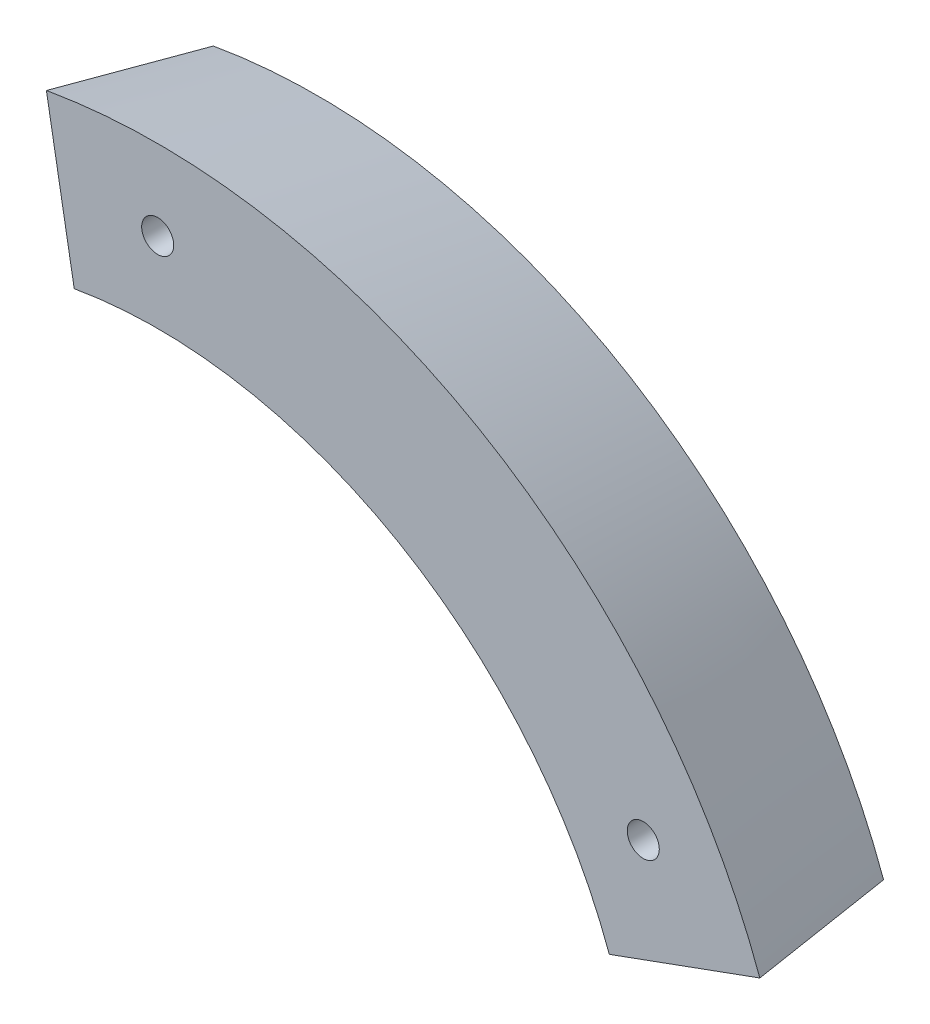
ISO-10303-21;
HEADER;
FILE_DESCRIPTION(('STEP AP214'),'2;1');
FILE_NAME('part.step','',(''),(''),'','','');
FILE_SCHEMA(('AUTOMOTIVE_DESIGN { 1 0 10303 214 1 1 1 1 }'));
ENDSEC;
DATA;
#1=APPLICATION_CONTEXT('core data for automotive mechanical design processes');
#2=APPLICATION_PROTOCOL_DEFINITION('international standard','automotive_design',2000,#1);
#3=PRODUCT_CONTEXT('',#1,'mechanical');
#4=PRODUCT('Part','Part','',(#3));
#5=PRODUCT_RELATED_PRODUCT_CATEGORY('part','',(#4));
#6=PRODUCT_DEFINITION_FORMATION('','',#4);
#7=PRODUCT_DEFINITION_CONTEXT('part definition',#1,'design');
#8=PRODUCT_DEFINITION('design','',#6,#7);
#9=PRODUCT_DEFINITION_SHAPE('','',#8);
#10=(LENGTH_UNIT() NAMED_UNIT(*) SI_UNIT(.MILLI.,.METRE.));
#11=(NAMED_UNIT(*) PLANE_ANGLE_UNIT() SI_UNIT($,.RADIAN.));
#12=(NAMED_UNIT(*) SI_UNIT($,.STERADIAN.) SOLID_ANGLE_UNIT());
#13=UNCERTAINTY_MEASURE_WITH_UNIT(LENGTH_MEASURE(1.E-05),#10,'distance_accuracy_value','');
#14=(GEOMETRIC_REPRESENTATION_CONTEXT(3) GLOBAL_UNCERTAINTY_ASSIGNED_CONTEXT((#13)) GLOBAL_UNIT_ASSIGNED_CONTEXT((#10,
#11,#12)) REPRESENTATION_CONTEXT('',''));
#15=CARTESIAN_POINT('',(0.,0.,0.));
#16=DIRECTION('',(0.,0.,1.));
#17=DIRECTION('',(1.,0.,0.));
#18=AXIS2_PLACEMENT_3D('',#15,#16,#17);
#19=CARTESIAN_POINT('',(0.,0.,0.));
#20=DIRECTION('',(0.,0.,1.));
#21=DIRECTION('',(1.,0.,0.));
#22=AXIS2_PLACEMENT_3D('',#19,#20,#21);
#23=PLANE('',#22);
#24=CARTESIAN_POINT('',(0.,52.5,0.));
#25=DIRECTION('',(0.,0.,1.));
#26=DIRECTION('',(1.,0.,0.));
#27=AXIS2_PLACEMENT_3D('',#24,#25,#26);
#28=CIRCLE('',#27,3.);
#29=CARTESIAN_POINT('',(3.,52.5,0.));
#30=VERTEX_POINT('',#29);
#31=EDGE_CURVE('E121',#30,#30,#28,.T.);
#32=ORIENTED_EDGE('',*,*,#31,.T.);
#33=EDGE_LOOP('',(#32));
#34=FACE_BOUND('',#33,.T.);
#35=CARTESIAN_POINT('',(45.4663336986831,26.2499999999999,0.));
#36=DIRECTION('',(0.,0.,1.));
#37=DIRECTION('',(1.,0.,0.));
#38=AXIS2_PLACEMENT_3D('',#35,#36,#37);
#39=CIRCLE('',#38,3.);
#40=CARTESIAN_POINT('',(48.4663336986831,26.2499999999999,0.));
#41=VERTEX_POINT('',#40);
#42=EDGE_CURVE('E127',#41,#41,#39,.T.);
#43=ORIENTED_EDGE('',*,*,#42,.T.);
#44=EDGE_LOOP('',(#43));
#45=FACE_BOUND('',#44,.T.);
#46=DIRECTION('',(-0.173648177666924,0.984807753012209,0.));
#47=VECTOR('',#46,1.);
#48=CARTESIAN_POINT('',(0.,0.,0.));
#49=LINE('',#48,#47);
#50=CARTESIAN_POINT('',(-7.81416799501157,44.3163488855494,0.));
#51=VERTEX_POINT('',#50);
#52=CARTESIAN_POINT('',(-9.78820516899551,55.5116700216144,0.));
#53=VERTEX_POINT('',#52);
#54=EDGE_CURVE('E95',#51,#53,#49,.T.);
#55=ORIENTED_EDGE('',*,*,#54,.T.);
#56=CARTESIAN_POINT('',(0.,0.,0.));
#57=DIRECTION('',(0.,0.,1.));
#58=DIRECTION('',(1.,0.,0.));
#59=AXIS2_PLACEMENT_3D('',#56,#57,#58);
#60=CIRCLE('',#59,56.3680270101674);
#61=CARTESIAN_POINT('',(52.968619029715,19.2790006770029,0.));
#62=VERTEX_POINT('',#61);
#63=EDGE_CURVE('E201',#62,#53,#60,.T.);
#64=ORIENTED_EDGE('',*,*,#63,.F.);
#65=DIRECTION('',(0.939692620785907,0.342020143325673,0.));
#66=VECTOR('',#65,1.);
#67=CARTESIAN_POINT('',(0.,0.,0.));
#68=LINE('',#67,#66);
#69=CARTESIAN_POINT('',(42.2861679353658,15.3909064496553,0.));
#70=VERTEX_POINT('',#69);
#71=EDGE_CURVE('E97',#70,#62,#68,.T.);
#72=ORIENTED_EDGE('',*,*,#71,.F.);
#73=CARTESIAN_POINT('',(0.,0.,0.));
#74=DIRECTION('',(0.,0.,1.));
#75=DIRECTION('',(1.,0.,0.));
#76=AXIS2_PLACEMENT_3D('',#73,#74,#75);
#77=CIRCLE('',#76,45.);
#78=EDGE_CURVE('E85',#70,#51,#77,.T.);
#79=ORIENTED_EDGE('',*,*,#78,.T.);
#80=EDGE_LOOP('',(#55,#64,#72,#79));
#81=FACE_BOUND('',#80,.T.);
#82=ADVANCED_FACE('F47',(#34,#45,#81),#23,.F.);
#83=CARTESIAN_POINT('',(0.,0.,15.));
#84=DIRECTION('',(0.,0.,-1.));
#85=DIRECTION('',(-1.,0.,0.));
#86=AXIS2_PLACEMENT_3D('',#83,#84,#85);
#87=CYLINDRICAL_SURFACE('',#86,45.);
#88=ORIENTED_EDGE('',*,*,#78,.F.);
#89=DIRECTION('',(0.,0.,-1.));
#90=VECTOR('',#89,1.);
#91=CARTESIAN_POINT('',(42.2861679353658,15.3909064496553,15.));
#92=LINE('',#91,#90);
#93=CARTESIAN_POINT('',(42.2861679353658,15.3909064496553,15.));
#94=VERTEX_POINT('',#93);
#95=EDGE_CURVE('E11',#94,#70,#92,.T.);
#96=ORIENTED_EDGE('',*,*,#95,.F.);
#97=CARTESIAN_POINT('',(0.,0.,15.));
#98=DIRECTION('',(0.,0.,1.));
#99=DIRECTION('',(1.,0.,0.));
#100=AXIS2_PLACEMENT_3D('',#97,#98,#99);
#101=CIRCLE('',#100,45.);
#102=CARTESIAN_POINT('',(-7.81416799501157,44.3163488855494,15.));
#103=VERTEX_POINT('',#102);
#104=EDGE_CURVE('E87',#94,#103,#101,.T.);
#105=ORIENTED_EDGE('',*,*,#104,.T.);
#106=DIRECTION('',(0.,0.,-1.));
#107=VECTOR('',#106,1.);
#108=CARTESIAN_POINT('',(-7.81416799501157,44.3163488855494,15.));
#109=LINE('',#108,#107);
#110=EDGE_CURVE('E57',#103,#51,#109,.T.);
#111=ORIENTED_EDGE('',*,*,#110,.T.);
#112=EDGE_LOOP('',(#88,#96,#105,#111));
#113=FACE_BOUND('',#112,.T.);
#114=ADVANCED_FACE('F49',(#113),#87,.F.);
#115=CARTESIAN_POINT('',(0.,0.,15.));
#116=DIRECTION('',(-0.342020143325673,0.939692620785907,0.));
#117=DIRECTION('',(-0.939692620785907,-0.342020143325673,0.));
#118=AXIS2_PLACEMENT_3D('',#115,#116,#117);
#119=PLANE('',#118);
#120=ORIENTED_EDGE('',*,*,#71,.T.);
#121=DIRECTION('',(-0.22113910369932,-0.0804880513788607,-0.971915207412815));
#122=VECTOR('',#121,1.);
#123=CARTESIAN_POINT('',(0.,0.,-232.799199641479));
#124=LINE('',#123,#122);
#125=CARTESIAN_POINT('',(56.3815572471544,20.5212085995404,15.));
#126=VERTEX_POINT('',#125);
#127=EDGE_CURVE('E65',#62,#126,#124,.F.);
#128=ORIENTED_EDGE('',*,*,#127,.T.);
#129=DIRECTION('',(0.939692620785907,0.342020143325673,0.));
#130=VECTOR('',#129,1.);
#131=CARTESIAN_POINT('',(0.,0.,15.));
#132=LINE('',#131,#130);
#133=EDGE_CURVE('E108',#94,#126,#132,.T.);
#134=ORIENTED_EDGE('',*,*,#133,.F.);
#135=ORIENTED_EDGE('',*,*,#95,.T.);
#136=EDGE_LOOP('',(#120,#128,#134,#135));
#137=FACE_BOUND('',#136,.T.);
#138=ADVANCED_FACE('F185',(#137),#119,.F.);
#139=CARTESIAN_POINT('',(45.4663336986831,26.2499999999999,15.));
#140=DIRECTION('',(0.,0.,-1.));
#141=DIRECTION('',(-1.,0.,0.));
#142=AXIS2_PLACEMENT_3D('',#139,#140,#141);
#143=CYLINDRICAL_SURFACE('',#142,1.5);
#144=CARTESIAN_POINT('',(45.4663336986831,26.2499999999999,12.));
#145=DIRECTION('',(0.,0.,1.));
#146=DIRECTION('',(1.,0.,0.));
#147=AXIS2_PLACEMENT_3D('',#144,#145,#146);
#148=CIRCLE('',#147,1.5);
#149=CARTESIAN_POINT('',(46.9663336986831,26.2499999999999,12.));
#150=VERTEX_POINT('',#149);
#151=EDGE_CURVE('E51',#150,#150,#148,.T.);
#152=ORIENTED_EDGE('',*,*,#151,.F.);
#153=EDGE_LOOP('',(#152));
#154=FACE_BOUND('',#153,.T.);
#155=CARTESIAN_POINT('',(45.4663336986831,26.2499999999999,15.));
#156=DIRECTION('',(0.,0.,1.));
#157=DIRECTION('',(1.,0.,0.));
#158=AXIS2_PLACEMENT_3D('',#155,#156,#157);
#159=CIRCLE('',#158,1.5);
#160=CARTESIAN_POINT('',(46.9663336986831,26.2499999999999,15.));
#161=VERTEX_POINT('',#160);
#162=EDGE_CURVE('E149',#161,#161,#159,.T.);
#163=ORIENTED_EDGE('',*,*,#162,.T.);
#164=EDGE_LOOP('',(#163));
#165=FACE_BOUND('',#164,.T.);
#166=ADVANCED_FACE('F188',(#154,#165),#143,.F.);
#167=CARTESIAN_POINT('',(0.,0.,15.));
#168=DIRECTION('',(-0.984807753012209,-0.173648177666924,0.));
#169=DIRECTION('',(0.173648177666924,-0.984807753012209,0.));
#170=AXIS2_PLACEMENT_3D('',#167,#168,#169);
#171=PLANE('',#170);
#172=DIRECTION('',(0.0408648546544591,-0.231756107263163,-0.971915207412815));
#173=VECTOR('',#172,1.);
#174=CARTESIAN_POINT('',(0.,0.,-232.799199641479));
#175=LINE('',#174,#173);
#176=CARTESIAN_POINT('',(-10.4188906600154,59.0884651807326,15.));
#177=VERTEX_POINT('',#176);
#178=EDGE_CURVE('E103',#53,#177,#175,.F.);
#179=ORIENTED_EDGE('',*,*,#178,.F.);
#180=ORIENTED_EDGE('',*,*,#54,.F.);
#181=ORIENTED_EDGE('',*,*,#110,.F.);
#182=DIRECTION('',(-0.173648177666924,0.984807753012209,0.));
#183=VECTOR('',#182,1.);
#184=CARTESIAN_POINT('',(0.,0.,15.));
#185=LINE('',#184,#183);
#186=EDGE_CURVE('E146',#103,#177,#185,.T.);
#187=ORIENTED_EDGE('',*,*,#186,.T.);
#188=EDGE_LOOP('',(#179,#180,#181,#187));
#189=FACE_BOUND('',#188,.T.);
#190=ADVANCED_FACE('F101',(#189),#171,.T.);
#191=CARTESIAN_POINT('',(0.,52.5,15.));
#192=DIRECTION('',(0.,0.,-1.));
#193=DIRECTION('',(-1.,0.,0.));
#194=AXIS2_PLACEMENT_3D('',#191,#192,#193);
#195=CYLINDRICAL_SURFACE('',#194,1.5);
#196=CARTESIAN_POINT('',(0.,52.5,12.));
#197=DIRECTION('',(0.,0.,1.));
#198=DIRECTION('',(1.,0.,0.));
#199=AXIS2_PLACEMENT_3D('',#196,#197,#198);
#200=CIRCLE('',#199,1.5);
#201=CARTESIAN_POINT('',(1.5,52.5,12.));
#202=VERTEX_POINT('',#201);
#203=EDGE_CURVE('E111',#202,#202,#200,.T.);
#204=ORIENTED_EDGE('',*,*,#203,.F.);
#205=EDGE_LOOP('',(#204));
#206=FACE_BOUND('',#205,.T.);
#207=CARTESIAN_POINT('',(0.,52.5,15.));
#208=DIRECTION('',(0.,0.,1.));
#209=DIRECTION('',(1.,0.,0.));
#210=AXIS2_PLACEMENT_3D('',#207,#208,#209);
#211=CIRCLE('',#210,1.5);
#212=CARTESIAN_POINT('',(1.5,52.5,15.));
#213=VERTEX_POINT('',#212);
#214=EDGE_CURVE('E90',#213,#213,#211,.T.);
#215=ORIENTED_EDGE('',*,*,#214,.T.);
#216=EDGE_LOOP('',(#215));
#217=FACE_BOUND('',#216,.T.);
#218=ADVANCED_FACE('F157',(#206,#217),#195,.F.);
#219=CARTESIAN_POINT('',(0.,0.,15.));
#220=DIRECTION('',(0.,0.,1.));
#221=DIRECTION('',(1.,0.,0.));
#222=AXIS2_PLACEMENT_3D('',#219,#220,#221);
#223=PLANE('',#222);
#224=ORIENTED_EDGE('',*,*,#104,.F.);
#225=ORIENTED_EDGE('',*,*,#133,.T.);
#226=CARTESIAN_POINT('',(0.,0.,15.));
#227=DIRECTION('',(0.,0.,1.));
#228=DIRECTION('',(1.,0.,0.));
#229=AXIS2_PLACEMENT_3D('',#226,#227,#228);
#230=CIRCLE('',#229,60.);
#231=EDGE_CURVE('E142',#126,#177,#230,.T.);
#232=ORIENTED_EDGE('',*,*,#231,.T.);
#233=ORIENTED_EDGE('',*,*,#186,.F.);
#234=EDGE_LOOP('',(#224,#225,#232,#233));
#235=FACE_BOUND('',#234,.T.);
#236=ORIENTED_EDGE('',*,*,#162,.F.);
#237=EDGE_LOOP('',(#236));
#238=FACE_BOUND('',#237,.T.);
#239=ORIENTED_EDGE('',*,*,#214,.F.);
#240=EDGE_LOOP('',(#239));
#241=FACE_BOUND('',#240,.T.);
#242=ADVANCED_FACE('F159',(#235,#238,#241),#223,.T.);
#243=CARTESIAN_POINT('',(45.4663336986831,26.2499999999999,12.));
#244=DIRECTION('',(0.,0.,-1.));
#245=DIRECTION('',(-1.,0.,0.));
#246=AXIS2_PLACEMENT_3D('',#243,#244,#245);
#247=CYLINDRICAL_SURFACE('',#246,3.);
#248=CARTESIAN_POINT('',(45.4663336986831,26.2499999999999,12.));
#249=DIRECTION('',(0.,0.,1.));
#250=DIRECTION('',(1.,0.,0.));
#251=AXIS2_PLACEMENT_3D('',#248,#249,#250);
#252=CIRCLE('',#251,3.);
#253=CARTESIAN_POINT('',(48.4663336986831,26.2499999999999,12.));
#254=VERTEX_POINT('',#253);
#255=EDGE_CURVE('E135',#254,#254,#252,.T.);
#256=ORIENTED_EDGE('',*,*,#255,.T.);
#257=EDGE_LOOP('',(#256));
#258=FACE_BOUND('',#257,.T.);
#259=ORIENTED_EDGE('',*,*,#42,.F.);
#260=EDGE_LOOP('',(#259));
#261=FACE_BOUND('',#260,.T.);
#262=ADVANCED_FACE('F161',(#258,#261),#247,.F.);
#263=CARTESIAN_POINT('',(45.4663336986831,26.2499999999999,12.));
#264=DIRECTION('',(0.,0.,1.));
#265=DIRECTION('',(1.,0.,0.));
#266=AXIS2_PLACEMENT_3D('',#263,#264,#265);
#267=PLANE('',#266);
#268=ORIENTED_EDGE('',*,*,#151,.T.);
#269=EDGE_LOOP('',(#268));
#270=FACE_BOUND('',#269,.T.);
#271=ORIENTED_EDGE('',*,*,#255,.F.);
#272=EDGE_LOOP('',(#271));
#273=FACE_BOUND('',#272,.T.);
#274=ADVANCED_FACE('F169',(#270,#273),#267,.F.);
#275=CARTESIAN_POINT('',(0.,52.5,12.));
#276=DIRECTION('',(0.,0.,-1.));
#277=DIRECTION('',(-1.,0.,0.));
#278=AXIS2_PLACEMENT_3D('',#275,#276,#277);
#279=CYLINDRICAL_SURFACE('',#278,3.);
#280=CARTESIAN_POINT('',(0.,52.5,12.));
#281=DIRECTION('',(0.,0.,1.));
#282=DIRECTION('',(1.,0.,0.));
#283=AXIS2_PLACEMENT_3D('',#280,#281,#282);
#284=CIRCLE('',#283,3.);
#285=CARTESIAN_POINT('',(3.,52.5,12.));
#286=VERTEX_POINT('',#285);
#287=EDGE_CURVE('E114',#286,#286,#284,.T.);
#288=ORIENTED_EDGE('',*,*,#287,.T.);
#289=EDGE_LOOP('',(#288));
#290=FACE_BOUND('',#289,.T.);
#291=ORIENTED_EDGE('',*,*,#31,.F.);
#292=EDGE_LOOP('',(#291));
#293=FACE_BOUND('',#292,.T.);
#294=ADVANCED_FACE('F206',(#290,#293),#279,.F.);
#295=CARTESIAN_POINT('',(0.,52.5,12.));
#296=DIRECTION('',(0.,0.,1.));
#297=DIRECTION('',(1.,0.,0.));
#298=AXIS2_PLACEMENT_3D('',#295,#296,#297);
#299=PLANE('',#298);
#300=ORIENTED_EDGE('',*,*,#203,.T.);
#301=EDGE_LOOP('',(#300));
#302=FACE_BOUND('',#301,.T.);
#303=ORIENTED_EDGE('',*,*,#287,.F.);
#304=EDGE_LOOP('',(#303));
#305=FACE_BOUND('',#304,.T.);
#306=ADVANCED_FACE('F202',(#302,#305),#299,.F.);
#307=CARTESIAN_POINT('',(0.,0.,0.));
#308=DIRECTION('',(0.,0.,1.));
#309=DIRECTION('',(1.,0.,0.));
#310=AXIS2_PLACEMENT_3D('',#307,#308,#309);
#311=CONICAL_SURFACE('',#310,56.3680270101674,0.237559446715749);
#312=ORIENTED_EDGE('',*,*,#63,.T.);
#313=ORIENTED_EDGE('',*,*,#178,.T.);
#314=ORIENTED_EDGE('',*,*,#231,.F.);
#315=ORIENTED_EDGE('',*,*,#127,.F.);
#316=EDGE_LOOP('',(#312,#313,#314,#315));
#317=FACE_BOUND('',#316,.T.);
#318=ADVANCED_FACE('F200',(#317),#311,.T.);
#319=CLOSED_SHELL('',(#82,#114,#138,#166,#190,#218,#242,#262,#274,#294,#306,#318));
#320=MANIFOLD_SOLID_BREP('B2',#319);
#321=ADVANCED_BREP_SHAPE_REPRESENTATION('',(#18,#320),#14);
#322=SHAPE_DEFINITION_REPRESENTATION(#9,#321);
ENDSEC;
END-ISO-10303-21;
